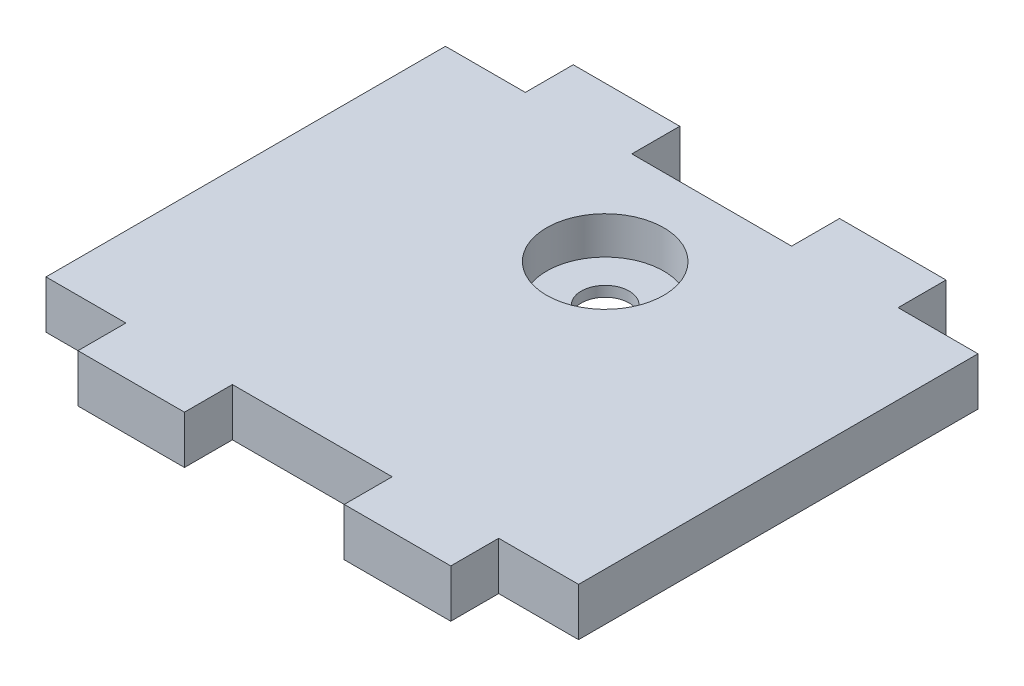
ISO-10303-21;
HEADER;
FILE_DESCRIPTION(('STEP AP214'),'2;1');
FILE_NAME('part.step','',(''),(''),'','','');
FILE_SCHEMA(('AUTOMOTIVE_DESIGN { 1 0 10303 214 1 1 1 1 }'));
ENDSEC;
DATA;
#1=APPLICATION_CONTEXT('core data for automotive mechanical design processes');
#2=APPLICATION_PROTOCOL_DEFINITION('international standard','automotive_design',2000,#1);
#3=PRODUCT_CONTEXT('',#1,'mechanical');
#4=PRODUCT('Part','Part','',(#3));
#5=PRODUCT_RELATED_PRODUCT_CATEGORY('part','',(#4));
#6=PRODUCT_DEFINITION_FORMATION('','',#4);
#7=PRODUCT_DEFINITION_CONTEXT('part definition',#1,'design');
#8=PRODUCT_DEFINITION('design','',#6,#7);
#9=PRODUCT_DEFINITION_SHAPE('','',#8);
#10=(LENGTH_UNIT() NAMED_UNIT(*) SI_UNIT(.MILLI.,.METRE.));
#11=(NAMED_UNIT(*) PLANE_ANGLE_UNIT() SI_UNIT($,.RADIAN.));
#12=(NAMED_UNIT(*) SI_UNIT($,.STERADIAN.) SOLID_ANGLE_UNIT());
#13=UNCERTAINTY_MEASURE_WITH_UNIT(LENGTH_MEASURE(1.E-05),#10,'distance_accuracy_value','');
#14=(GEOMETRIC_REPRESENTATION_CONTEXT(3) GLOBAL_UNCERTAINTY_ASSIGNED_CONTEXT((#13)) GLOBAL_UNIT_ASSIGNED_CONTEXT((#10,
#11,#12)) REPRESENTATION_CONTEXT('',''));
#15=CARTESIAN_POINT('',(0.,0.,0.));
#16=DIRECTION('',(0.,0.,1.));
#17=DIRECTION('',(1.,0.,0.));
#18=AXIS2_PLACEMENT_3D('',#15,#16,#17);
#19=CARTESIAN_POINT('',(0.,9.,-17.5));
#20=DIRECTION('',(0.,-1.,0.));
#21=DIRECTION('',(0.,0.,-1.));
#22=AXIS2_PLACEMENT_3D('',#19,#20,#21);
#23=CYLINDRICAL_SURFACE('',#22,4.5);
#24=CARTESIAN_POINT('',(0.,0.,-17.5));
#25=DIRECTION('',(0.,1.,0.));
#26=DIRECTION('',(0.,0.,1.));
#27=AXIS2_PLACEMENT_3D('',#24,#25,#26);
#28=CIRCLE('',#27,4.5);
#29=CARTESIAN_POINT('',(0.,0.,-13.));
#30=VERTEX_POINT('',#29);
#31=EDGE_CURVE('E203',#30,#30,#28,.T.);
#32=ORIENTED_EDGE('',*,*,#31,.F.);
#33=EDGE_LOOP('',(#32));
#34=FACE_BOUND('',#33,.T.);
#35=CARTESIAN_POINT('',(0.,1.95,-17.5));
#36=DIRECTION('',(0.,1.,0.));
#37=DIRECTION('',(0.,0.,1.));
#38=AXIS2_PLACEMENT_3D('',#35,#36,#37);
#39=CIRCLE('',#38,4.5);
#40=CARTESIAN_POINT('',(0.,1.95,-13.));
#41=VERTEX_POINT('',#40);
#42=EDGE_CURVE('E39',#41,#41,#39,.T.);
#43=ORIENTED_EDGE('',*,*,#42,.T.);
#44=EDGE_LOOP('',(#43));
#45=FACE_BOUND('',#44,.T.);
#46=ADVANCED_FACE('F36',(#34,#45),#23,.F.);
#47=CARTESIAN_POINT('',(50.,9.,0.));
#48=DIRECTION('',(1.,0.,0.));
#49=DIRECTION('',(0.,0.,-1.));
#50=AXIS2_PLACEMENT_3D('',#47,#48,#49);
#51=PLANE('',#50);
#52=DIRECTION('',(0.,0.,1.));
#53=VECTOR('',#52,1.);
#54=CARTESIAN_POINT('',(50.,0.,0.));
#55=LINE('',#54,#53);
#56=CARTESIAN_POINT('',(50.,0.,-37.5));
#57=VERTEX_POINT('',#56);
#58=CARTESIAN_POINT('',(50.,0.,37.5));
#59=VERTEX_POINT('',#58);
#60=EDGE_CURVE('E206',#57,#59,#55,.T.);
#61=ORIENTED_EDGE('',*,*,#60,.F.);
#62=DIRECTION('',(0.,-1.,0.));
#63=VECTOR('',#62,1.);
#64=CARTESIAN_POINT('',(50.,9.,-37.5));
#65=LINE('',#64,#63);
#66=CARTESIAN_POINT('',(50.,9.,-37.5));
#67=VERTEX_POINT('',#66);
#68=EDGE_CURVE('E11',#67,#57,#65,.T.);
#69=ORIENTED_EDGE('',*,*,#68,.F.);
#70=DIRECTION('',(0.,0.,1.));
#71=VECTOR('',#70,1.);
#72=CARTESIAN_POINT('',(50.,9.,0.));
#73=LINE('',#72,#71);
#74=CARTESIAN_POINT('',(50.,9.,37.5));
#75=VERTEX_POINT('',#74);
#76=EDGE_CURVE('E307',#67,#75,#73,.T.);
#77=ORIENTED_EDGE('',*,*,#76,.T.);
#78=DIRECTION('',(0.,-1.,0.));
#79=VECTOR('',#78,1.);
#80=CARTESIAN_POINT('',(50.,9.,37.5));
#81=LINE('',#80,#79);
#82=EDGE_CURVE('E123',#75,#59,#81,.T.);
#83=ORIENTED_EDGE('',*,*,#82,.T.);
#84=EDGE_LOOP('',(#61,#69,#77,#83));
#85=FACE_BOUND('',#84,.T.);
#86=ADVANCED_FACE('F306',(#85),#51,.T.);
#87=CARTESIAN_POINT('',(0.,9.,-37.5));
#88=DIRECTION('',(0.,0.,-1.));
#89=DIRECTION('',(-1.,0.,0.));
#90=AXIS2_PLACEMENT_3D('',#87,#88,#89);
#91=PLANE('',#90);
#92=DIRECTION('',(1.,0.,0.));
#93=VECTOR('',#92,1.);
#94=CARTESIAN_POINT('',(0.,0.,-37.5));
#95=LINE('',#94,#93);
#96=CARTESIAN_POINT('',(35.,0.,-37.5));
#97=VERTEX_POINT('',#96);
#98=EDGE_CURVE('E209',#97,#57,#95,.T.);
#99=ORIENTED_EDGE('',*,*,#98,.F.);
#100=DIRECTION('',(0.,-1.,0.));
#101=VECTOR('',#100,1.);
#102=CARTESIAN_POINT('',(35.,9.,-37.5));
#103=LINE('',#102,#101);
#104=CARTESIAN_POINT('',(35.,9.,-37.5));
#105=VERTEX_POINT('',#104);
#106=EDGE_CURVE('E45',#105,#97,#103,.T.);
#107=ORIENTED_EDGE('',*,*,#106,.F.);
#108=DIRECTION('',(1.,0.,0.));
#109=VECTOR('',#108,1.);
#110=CARTESIAN_POINT('',(0.,9.,-37.5));
#111=LINE('',#110,#109);
#112=EDGE_CURVE('E305',#105,#67,#111,.T.);
#113=ORIENTED_EDGE('',*,*,#112,.T.);
#114=ORIENTED_EDGE('',*,*,#68,.T.);
#115=EDGE_LOOP('',(#99,#107,#113,#114));
#116=FACE_BOUND('',#115,.T.);
#117=ADVANCED_FACE('F304',(#116),#91,.T.);
#118=CARTESIAN_POINT('',(35.,9.,0.));
#119=DIRECTION('',(-1.,0.,0.));
#120=DIRECTION('',(0.,0.,1.));
#121=AXIS2_PLACEMENT_3D('',#118,#119,#120);
#122=PLANE('',#121);
#123=DIRECTION('',(0.,0.,-1.));
#124=VECTOR('',#123,1.);
#125=CARTESIAN_POINT('',(35.,0.,0.));
#126=LINE('',#125,#124);
#127=CARTESIAN_POINT('',(35.,0.,-46.5));
#128=VERTEX_POINT('',#127);
#129=EDGE_CURVE('E212',#97,#128,#126,.T.);
#130=ORIENTED_EDGE('',*,*,#129,.T.);
#131=DIRECTION('',(0.,-1.,0.));
#132=VECTOR('',#131,1.);
#133=CARTESIAN_POINT('',(35.,9.,-46.5));
#134=LINE('',#133,#132);
#135=CARTESIAN_POINT('',(35.,9.,-46.5));
#136=VERTEX_POINT('',#135);
#137=EDGE_CURVE('E288',#136,#128,#134,.T.);
#138=ORIENTED_EDGE('',*,*,#137,.F.);
#139=DIRECTION('',(0.,0.,-1.));
#140=VECTOR('',#139,1.);
#141=CARTESIAN_POINT('',(35.,9.,0.));
#142=LINE('',#141,#140);
#143=EDGE_CURVE('E297',#105,#136,#142,.T.);
#144=ORIENTED_EDGE('',*,*,#143,.F.);
#145=ORIENTED_EDGE('',*,*,#106,.T.);
#146=EDGE_LOOP('',(#130,#138,#144,#145));
#147=FACE_BOUND('',#146,.T.);
#148=ADVANCED_FACE('F294',(#147),#122,.F.);
#149=CARTESIAN_POINT('',(0.,9.,-46.5));
#150=DIRECTION('',(0.,0.,1.));
#151=DIRECTION('',(1.,0.,0.));
#152=AXIS2_PLACEMENT_3D('',#149,#150,#151);
#153=PLANE('',#152);
#154=DIRECTION('',(-1.,0.,0.));
#155=VECTOR('',#154,1.);
#156=CARTESIAN_POINT('',(0.,0.,-46.5));
#157=LINE('',#156,#155);
#158=CARTESIAN_POINT('',(15.,0.,-46.5));
#159=VERTEX_POINT('',#158);
#160=EDGE_CURVE('E217',#128,#159,#157,.T.);
#161=ORIENTED_EDGE('',*,*,#160,.T.);
#162=DIRECTION('',(0.,-1.,0.));
#163=VECTOR('',#162,1.);
#164=CARTESIAN_POINT('',(15.,9.,-46.5));
#165=LINE('',#164,#163);
#166=CARTESIAN_POINT('',(15.,9.,-46.5));
#167=VERTEX_POINT('',#166);
#168=EDGE_CURVE('E286',#167,#159,#165,.T.);
#169=ORIENTED_EDGE('',*,*,#168,.F.);
#170=DIRECTION('',(-1.,0.,0.));
#171=VECTOR('',#170,1.);
#172=CARTESIAN_POINT('',(0.,9.,-46.5));
#173=LINE('',#172,#171);
#174=EDGE_CURVE('E363',#136,#167,#173,.T.);
#175=ORIENTED_EDGE('',*,*,#174,.F.);
#176=ORIENTED_EDGE('',*,*,#137,.T.);
#177=EDGE_LOOP('',(#161,#169,#175,#176));
#178=FACE_BOUND('',#177,.T.);
#179=ADVANCED_FACE('F362',(#178),#153,.F.);
#180=CARTESIAN_POINT('',(15.,9.,0.));
#181=DIRECTION('',(-1.,0.,0.));
#182=DIRECTION('',(0.,0.,1.));
#183=AXIS2_PLACEMENT_3D('',#180,#181,#182);
#184=PLANE('',#183);
#185=DIRECTION('',(0.,0.,-1.));
#186=VECTOR('',#185,1.);
#187=CARTESIAN_POINT('',(15.,0.,0.));
#188=LINE('',#187,#186);
#189=CARTESIAN_POINT('',(15.,0.,-37.5));
#190=VERTEX_POINT('',#189);
#191=EDGE_CURVE('E220',#190,#159,#188,.T.);
#192=ORIENTED_EDGE('',*,*,#191,.F.);
#193=DIRECTION('',(0.,-1.,0.));
#194=VECTOR('',#193,1.);
#195=CARTESIAN_POINT('',(15.,9.,-37.5));
#196=LINE('',#195,#194);
#197=CARTESIAN_POINT('',(15.,9.,-37.5));
#198=VERTEX_POINT('',#197);
#199=EDGE_CURVE('E284',#198,#190,#196,.T.);
#200=ORIENTED_EDGE('',*,*,#199,.F.);
#201=DIRECTION('',(0.,0.,-1.));
#202=VECTOR('',#201,1.);
#203=CARTESIAN_POINT('',(15.,9.,0.));
#204=LINE('',#203,#202);
#205=EDGE_CURVE('E360',#198,#167,#204,.T.);
#206=ORIENTED_EDGE('',*,*,#205,.T.);
#207=ORIENTED_EDGE('',*,*,#168,.T.);
#208=EDGE_LOOP('',(#192,#200,#206,#207));
#209=FACE_BOUND('',#208,.T.);
#210=ADVANCED_FACE('F358',(#209),#184,.T.);
#211=CARTESIAN_POINT('',(-15.,0.,-37.5));
#212=VERTEX_POINT('',#211);
#213=EDGE_CURVE('E214',#212,#190,#95,.T.);
#214=ORIENTED_EDGE('',*,*,#213,.F.);
#215=DIRECTION('',(0.,-1.,0.));
#216=VECTOR('',#215,1.);
#217=CARTESIAN_POINT('',(-15.,9.,-37.5));
#218=LINE('',#217,#216);
#219=CARTESIAN_POINT('',(-15.,9.,-37.5));
#220=VERTEX_POINT('',#219);
#221=EDGE_CURVE('E282',#220,#212,#218,.T.);
#222=ORIENTED_EDGE('',*,*,#221,.F.);
#223=EDGE_CURVE('E354',#220,#198,#111,.T.);
#224=ORIENTED_EDGE('',*,*,#223,.T.);
#225=ORIENTED_EDGE('',*,*,#199,.T.);
#226=EDGE_LOOP('',(#214,#222,#224,#225));
#227=FACE_BOUND('',#226,.T.);
#228=ADVANCED_FACE('F350',(#227),#91,.T.);
#229=CARTESIAN_POINT('',(-15.,9.,0.));
#230=DIRECTION('',(-1.,0.,0.));
#231=DIRECTION('',(0.,0.,1.));
#232=AXIS2_PLACEMENT_3D('',#229,#230,#231);
#233=PLANE('',#232);
#234=DIRECTION('',(0.,0.,-1.));
#235=VECTOR('',#234,1.);
#236=CARTESIAN_POINT('',(-15.,0.,0.));
#237=LINE('',#236,#235);
#238=CARTESIAN_POINT('',(-15.,0.,-46.5));
#239=VERTEX_POINT('',#238);
#240=EDGE_CURVE('E223',#212,#239,#237,.T.);
#241=ORIENTED_EDGE('',*,*,#240,.T.);
#242=DIRECTION('',(0.,-1.,0.));
#243=VECTOR('',#242,1.);
#244=CARTESIAN_POINT('',(-15.,9.,-46.5));
#245=LINE('',#244,#243);
#246=CARTESIAN_POINT('',(-15.,9.,-46.5));
#247=VERTEX_POINT('',#246);
#248=EDGE_CURVE('E280',#247,#239,#245,.T.);
#249=ORIENTED_EDGE('',*,*,#248,.F.);
#250=DIRECTION('',(0.,0.,-1.));
#251=VECTOR('',#250,1.);
#252=CARTESIAN_POINT('',(-15.,9.,0.));
#253=LINE('',#252,#251);
#254=EDGE_CURVE('E370',#220,#247,#253,.T.);
#255=ORIENTED_EDGE('',*,*,#254,.F.);
#256=ORIENTED_EDGE('',*,*,#221,.T.);
#257=EDGE_LOOP('',(#241,#249,#255,#256));
#258=FACE_BOUND('',#257,.T.);
#259=ADVANCED_FACE('F393',(#258),#233,.F.);
#260=CARTESIAN_POINT('',(0.,9.,-46.5));
#261=DIRECTION('',(0.,0.,-1.));
#262=DIRECTION('',(-1.,0.,0.));
#263=AXIS2_PLACEMENT_3D('',#260,#261,#262);
#264=PLANE('',#263);
#265=DIRECTION('',(1.,0.,0.));
#266=VECTOR('',#265,1.);
#267=CARTESIAN_POINT('',(0.,0.,-46.5));
#268=LINE('',#267,#266);
#269=CARTESIAN_POINT('',(-35.,0.,-46.5));
#270=VERTEX_POINT('',#269);
#271=EDGE_CURVE('E226',#270,#239,#268,.T.);
#272=ORIENTED_EDGE('',*,*,#271,.F.);
#273=DIRECTION('',(0.,-1.,0.));
#274=VECTOR('',#273,1.);
#275=CARTESIAN_POINT('',(-35.,9.,-46.5));
#276=LINE('',#275,#274);
#277=CARTESIAN_POINT('',(-35.,9.,-46.5));
#278=VERTEX_POINT('',#277);
#279=EDGE_CURVE('E278',#278,#270,#276,.T.);
#280=ORIENTED_EDGE('',*,*,#279,.F.);
#281=DIRECTION('',(1.,0.,0.));
#282=VECTOR('',#281,1.);
#283=CARTESIAN_POINT('',(0.,9.,-46.5));
#284=LINE('',#283,#282);
#285=EDGE_CURVE('E372',#278,#247,#284,.T.);
#286=ORIENTED_EDGE('',*,*,#285,.T.);
#287=ORIENTED_EDGE('',*,*,#248,.T.);
#288=EDGE_LOOP('',(#272,#280,#286,#287));
#289=FACE_BOUND('',#288,.T.);
#290=ADVANCED_FACE('F390',(#289),#264,.T.);
#291=CARTESIAN_POINT('',(-35.,9.,0.));
#292=DIRECTION('',(-1.,0.,0.));
#293=DIRECTION('',(0.,0.,1.));
#294=AXIS2_PLACEMENT_3D('',#291,#292,#293);
#295=PLANE('',#294);
#296=DIRECTION('',(0.,0.,-1.));
#297=VECTOR('',#296,1.);
#298=CARTESIAN_POINT('',(-35.,0.,0.));
#299=LINE('',#298,#297);
#300=CARTESIAN_POINT('',(-35.,0.,-37.5));
#301=VERTEX_POINT('',#300);
#302=EDGE_CURVE('E229',#301,#270,#299,.T.);
#303=ORIENTED_EDGE('',*,*,#302,.F.);
#304=DIRECTION('',(0.,-1.,0.));
#305=VECTOR('',#304,1.);
#306=CARTESIAN_POINT('',(-35.,9.,-37.5));
#307=LINE('',#306,#305);
#308=CARTESIAN_POINT('',(-35.,9.,-37.5));
#309=VERTEX_POINT('',#308);
#310=EDGE_CURVE('E276',#309,#301,#307,.T.);
#311=ORIENTED_EDGE('',*,*,#310,.F.);
#312=DIRECTION('',(0.,0.,-1.));
#313=VECTOR('',#312,1.);
#314=CARTESIAN_POINT('',(-35.,9.,0.));
#315=LINE('',#314,#313);
#316=EDGE_CURVE('E375',#309,#278,#315,.T.);
#317=ORIENTED_EDGE('',*,*,#316,.T.);
#318=ORIENTED_EDGE('',*,*,#279,.T.);
#319=EDGE_LOOP('',(#303,#311,#317,#318));
#320=FACE_BOUND('',#319,.T.);
#321=ADVANCED_FACE('F387',(#320),#295,.T.);
#322=CARTESIAN_POINT('',(-50.,0.,-37.5));
#323=VERTEX_POINT('',#322);
#324=EDGE_CURVE('E213',#323,#301,#95,.T.);
#325=ORIENTED_EDGE('',*,*,#324,.F.);
#326=DIRECTION('',(0.,-1.,0.));
#327=VECTOR('',#326,1.);
#328=CARTESIAN_POINT('',(-50.,9.,-37.5));
#329=LINE('',#328,#327);
#330=CARTESIAN_POINT('',(-50.,9.,-37.5));
#331=VERTEX_POINT('',#330);
#332=EDGE_CURVE('E274',#331,#323,#329,.T.);
#333=ORIENTED_EDGE('',*,*,#332,.F.);
#334=EDGE_CURVE('E367',#331,#309,#111,.T.);
#335=ORIENTED_EDGE('',*,*,#334,.T.);
#336=ORIENTED_EDGE('',*,*,#310,.T.);
#337=EDGE_LOOP('',(#325,#333,#335,#336));
#338=FACE_BOUND('',#337,.T.);
#339=ADVANCED_FACE('F342',(#338),#91,.T.);
#340=CARTESIAN_POINT('',(-50.,9.,0.));
#341=DIRECTION('',(1.,0.,0.));
#342=DIRECTION('',(0.,0.,-1.));
#343=AXIS2_PLACEMENT_3D('',#340,#341,#342);
#344=PLANE('',#343);
#345=DIRECTION('',(0.,0.,1.));
#346=VECTOR('',#345,1.);
#347=CARTESIAN_POINT('',(-50.,0.,0.));
#348=LINE('',#347,#346);
#349=CARTESIAN_POINT('',(-50.,0.,37.5));
#350=VERTEX_POINT('',#349);
#351=EDGE_CURVE('E232',#323,#350,#348,.T.);
#352=ORIENTED_EDGE('',*,*,#351,.T.);
#353=DIRECTION('',(0.,-1.,0.));
#354=VECTOR('',#353,1.);
#355=CARTESIAN_POINT('',(-50.,9.,37.5));
#356=LINE('',#355,#354);
#357=CARTESIAN_POINT('',(-50.,9.,37.5));
#358=VERTEX_POINT('',#357);
#359=EDGE_CURVE('E271',#358,#350,#356,.T.);
#360=ORIENTED_EDGE('',*,*,#359,.F.);
#361=DIRECTION('',(0.,0.,1.));
#362=VECTOR('',#361,1.);
#363=CARTESIAN_POINT('',(-50.,9.,0.));
#364=LINE('',#363,#362);
#365=EDGE_CURVE('E378',#331,#358,#364,.T.);
#366=ORIENTED_EDGE('',*,*,#365,.F.);
#367=ORIENTED_EDGE('',*,*,#332,.T.);
#368=EDGE_LOOP('',(#352,#360,#366,#367));
#369=FACE_BOUND('',#368,.T.);
#370=ADVANCED_FACE('F338',(#369),#344,.F.);
#371=CARTESIAN_POINT('',(0.,9.,37.5));
#372=DIRECTION('',(0.,0.,-1.));
#373=DIRECTION('',(-1.,0.,0.));
#374=AXIS2_PLACEMENT_3D('',#371,#372,#373);
#375=PLANE('',#374);
#376=DIRECTION('',(1.,0.,0.));
#377=VECTOR('',#376,1.);
#378=CARTESIAN_POINT('',(0.,0.,37.5));
#379=LINE('',#378,#377);
#380=CARTESIAN_POINT('',(-35.,0.,37.5));
#381=VERTEX_POINT('',#380);
#382=EDGE_CURVE('E235',#350,#381,#379,.T.);
#383=ORIENTED_EDGE('',*,*,#382,.T.);
#384=DIRECTION('',(0.,-1.,0.));
#385=VECTOR('',#384,1.);
#386=CARTESIAN_POINT('',(-35.,9.,37.5));
#387=LINE('',#386,#385);
#388=CARTESIAN_POINT('',(-35.,9.,37.5));
#389=VERTEX_POINT('',#388);
#390=EDGE_CURVE('E268',#389,#381,#387,.T.);
#391=ORIENTED_EDGE('',*,*,#390,.F.);
#392=DIRECTION('',(1.,0.,0.));
#393=VECTOR('',#392,1.);
#394=CARTESIAN_POINT('',(0.,9.,37.5));
#395=LINE('',#394,#393);
#396=EDGE_CURVE('E200',#358,#389,#395,.T.);
#397=ORIENTED_EDGE('',*,*,#396,.F.);
#398=ORIENTED_EDGE('',*,*,#359,.T.);
#399=EDGE_LOOP('',(#383,#391,#397,#398));
#400=FACE_BOUND('',#399,.T.);
#401=ADVANCED_FACE('F333',(#400),#375,.F.);
#402=CARTESIAN_POINT('',(-35.0000000000001,9.,0.));
#403=DIRECTION('',(1.,0.,0.));
#404=DIRECTION('',(0.,0.,-1.));
#405=AXIS2_PLACEMENT_3D('',#402,#403,#404);
#406=PLANE('',#405);
#407=DIRECTION('',(0.,0.,1.));
#408=VECTOR('',#407,1.);
#409=CARTESIAN_POINT('',(-35.0000000000001,0.,0.));
#410=LINE('',#409,#408);
#411=CARTESIAN_POINT('',(-35.,0.,46.5));
#412=VERTEX_POINT('',#411);
#413=EDGE_CURVE('E238',#381,#412,#410,.T.);
#414=ORIENTED_EDGE('',*,*,#413,.T.);
#415=DIRECTION('',(0.,-1.,0.));
#416=VECTOR('',#415,1.);
#417=CARTESIAN_POINT('',(-35.,9.,46.5));
#418=LINE('',#417,#416);
#419=CARTESIAN_POINT('',(-35.,9.,46.5));
#420=VERTEX_POINT('',#419);
#421=EDGE_CURVE('E265',#420,#412,#418,.T.);
#422=ORIENTED_EDGE('',*,*,#421,.F.);
#423=DIRECTION('',(0.,0.,1.));
#424=VECTOR('',#423,1.);
#425=CARTESIAN_POINT('',(-35.0000000000001,9.,0.));
#426=LINE('',#425,#424);
#427=EDGE_CURVE('E330',#389,#420,#426,.T.);
#428=ORIENTED_EDGE('',*,*,#427,.F.);
#429=ORIENTED_EDGE('',*,*,#390,.T.);
#430=EDGE_LOOP('',(#414,#422,#428,#429));
#431=FACE_BOUND('',#430,.T.);
#432=ADVANCED_FACE('F328',(#431),#406,.F.);
#433=CARTESIAN_POINT('',(0.,9.,46.5));
#434=DIRECTION('',(0.,0.,-1.));
#435=DIRECTION('',(-1.,0.,0.));
#436=AXIS2_PLACEMENT_3D('',#433,#434,#435);
#437=PLANE('',#436);
#438=DIRECTION('',(1.,0.,0.));
#439=VECTOR('',#438,1.);
#440=CARTESIAN_POINT('',(0.,0.,46.5));
#441=LINE('',#440,#439);
#442=CARTESIAN_POINT('',(-15.,0.,46.5));
#443=VERTEX_POINT('',#442);
#444=EDGE_CURVE('E243',#412,#443,#441,.T.);
#445=ORIENTED_EDGE('',*,*,#444,.T.);
#446=DIRECTION('',(0.,-1.,0.));
#447=VECTOR('',#446,1.);
#448=CARTESIAN_POINT('',(-15.,9.,46.5));
#449=LINE('',#448,#447);
#450=CARTESIAN_POINT('',(-15.,9.,46.5));
#451=VERTEX_POINT('',#450);
#452=EDGE_CURVE('E263',#451,#443,#449,.T.);
#453=ORIENTED_EDGE('',*,*,#452,.F.);
#454=DIRECTION('',(1.,0.,0.));
#455=VECTOR('',#454,1.);
#456=CARTESIAN_POINT('',(0.,9.,46.5));
#457=LINE('',#456,#455);
#458=EDGE_CURVE('E381',#420,#451,#457,.T.);
#459=ORIENTED_EDGE('',*,*,#458,.F.);
#460=ORIENTED_EDGE('',*,*,#421,.T.);
#461=EDGE_LOOP('',(#445,#453,#459,#460));
#462=FACE_BOUND('',#461,.T.);
#463=ADVANCED_FACE('F323',(#462),#437,.F.);
#464=CARTESIAN_POINT('',(-15.,9.,0.));
#465=DIRECTION('',(1.,0.,0.));
#466=DIRECTION('',(0.,0.,-1.));
#467=AXIS2_PLACEMENT_3D('',#464,#465,#466);
#468=PLANE('',#467);
#469=DIRECTION('',(0.,0.,1.));
#470=VECTOR('',#469,1.);
#471=CARTESIAN_POINT('',(-15.,0.,0.));
#472=LINE('',#471,#470);
#473=CARTESIAN_POINT('',(-15.,0.,37.5));
#474=VERTEX_POINT('',#473);
#475=EDGE_CURVE('E246',#474,#443,#472,.T.);
#476=ORIENTED_EDGE('',*,*,#475,.F.);
#477=DIRECTION('',(0.,-1.,0.));
#478=VECTOR('',#477,1.);
#479=CARTESIAN_POINT('',(-15.,9.,37.5));
#480=LINE('',#479,#478);
#481=CARTESIAN_POINT('',(-15.,9.,37.5));
#482=VERTEX_POINT('',#481);
#483=EDGE_CURVE('E261',#482,#474,#480,.T.);
#484=ORIENTED_EDGE('',*,*,#483,.F.);
#485=DIRECTION('',(0.,0.,1.));
#486=VECTOR('',#485,1.);
#487=CARTESIAN_POINT('',(-15.,9.,0.));
#488=LINE('',#487,#486);
#489=EDGE_CURVE('E321',#482,#451,#488,.T.);
#490=ORIENTED_EDGE('',*,*,#489,.T.);
#491=ORIENTED_EDGE('',*,*,#452,.T.);
#492=EDGE_LOOP('',(#476,#484,#490,#491));
#493=FACE_BOUND('',#492,.T.);
#494=ADVANCED_FACE('F317',(#493),#468,.T.);
#495=CARTESIAN_POINT('',(15.,0.,37.5));
#496=VERTEX_POINT('',#495);
#497=EDGE_CURVE('E240',#474,#496,#379,.T.);
#498=ORIENTED_EDGE('',*,*,#497,.T.);
#499=DIRECTION('',(0.,-1.,0.));
#500=VECTOR('',#499,1.);
#501=CARTESIAN_POINT('',(15.,9.,37.5));
#502=LINE('',#501,#500);
#503=CARTESIAN_POINT('',(15.,9.,37.5));
#504=VERTEX_POINT('',#503);
#505=EDGE_CURVE('E258',#504,#496,#502,.T.);
#506=ORIENTED_EDGE('',*,*,#505,.F.);
#507=EDGE_CURVE('E199',#482,#504,#395,.T.);
#508=ORIENTED_EDGE('',*,*,#507,.F.);
#509=ORIENTED_EDGE('',*,*,#483,.T.);
#510=EDGE_LOOP('',(#498,#506,#508,#509));
#511=FACE_BOUND('',#510,.T.);
#512=ADVANCED_FACE('F313',(#511),#375,.F.);
#513=CARTESIAN_POINT('',(15.,9.,0.));
#514=DIRECTION('',(1.,0.,0.));
#515=DIRECTION('',(0.,0.,-1.));
#516=AXIS2_PLACEMENT_3D('',#513,#514,#515);
#517=PLANE('',#516);
#518=DIRECTION('',(0.,0.,1.));
#519=VECTOR('',#518,1.);
#520=CARTESIAN_POINT('',(15.,0.,0.));
#521=LINE('',#520,#519);
#522=CARTESIAN_POINT('',(15.,0.,46.5));
#523=VERTEX_POINT('',#522);
#524=EDGE_CURVE('E249',#496,#523,#521,.T.);
#525=ORIENTED_EDGE('',*,*,#524,.T.);
#526=DIRECTION('',(0.,-1.,0.));
#527=VECTOR('',#526,1.);
#528=CARTESIAN_POINT('',(15.,9.,46.5));
#529=LINE('',#528,#527);
#530=CARTESIAN_POINT('',(15.,9.,46.5));
#531=VERTEX_POINT('',#530);
#532=EDGE_CURVE('E188',#531,#523,#529,.T.);
#533=ORIENTED_EDGE('',*,*,#532,.F.);
#534=DIRECTION('',(0.,0.,1.));
#535=VECTOR('',#534,1.);
#536=CARTESIAN_POINT('',(15.,9.,0.));
#537=LINE('',#536,#535);
#538=EDGE_CURVE('E193',#504,#531,#537,.T.);
#539=ORIENTED_EDGE('',*,*,#538,.F.);
#540=ORIENTED_EDGE('',*,*,#505,.T.);
#541=EDGE_LOOP('',(#525,#533,#539,#540));
#542=FACE_BOUND('',#541,.T.);
#543=ADVANCED_FACE('F442',(#542),#517,.F.);
#544=CARTESIAN_POINT('',(0.,9.,46.5));
#545=DIRECTION('',(0.,0.,1.));
#546=DIRECTION('',(1.,0.,0.));
#547=AXIS2_PLACEMENT_3D('',#544,#545,#546);
#548=PLANE('',#547);
#549=DIRECTION('',(-1.,0.,0.));
#550=VECTOR('',#549,1.);
#551=CARTESIAN_POINT('',(0.,0.,46.5));
#552=LINE('',#551,#550);
#553=CARTESIAN_POINT('',(35.,0.,46.5));
#554=VERTEX_POINT('',#553);
#555=EDGE_CURVE('E183',#554,#523,#552,.T.);
#556=ORIENTED_EDGE('',*,*,#555,.F.);
#557=DIRECTION('',(0.,-1.,0.));
#558=VECTOR('',#557,1.);
#559=CARTESIAN_POINT('',(35.,9.,46.5));
#560=LINE('',#559,#558);
#561=CARTESIAN_POINT('',(35.,9.,46.5));
#562=VERTEX_POINT('',#561);
#563=EDGE_CURVE('E178',#562,#554,#560,.T.);
#564=ORIENTED_EDGE('',*,*,#563,.F.);
#565=DIRECTION('',(-1.,0.,0.));
#566=VECTOR('',#565,1.);
#567=CARTESIAN_POINT('',(0.,9.,46.5));
#568=LINE('',#567,#566);
#569=EDGE_CURVE('E181',#562,#531,#568,.T.);
#570=ORIENTED_EDGE('',*,*,#569,.T.);
#571=ORIENTED_EDGE('',*,*,#532,.T.);
#572=EDGE_LOOP('',(#556,#564,#570,#571));
#573=FACE_BOUND('',#572,.T.);
#574=ADVANCED_FACE('F180',(#573),#548,.T.);
#575=CARTESIAN_POINT('',(35.,9.,0.));
#576=DIRECTION('',(1.,0.,0.));
#577=DIRECTION('',(0.,0.,-1.));
#578=AXIS2_PLACEMENT_3D('',#575,#576,#577);
#579=PLANE('',#578);
#580=DIRECTION('',(0.,0.,1.));
#581=VECTOR('',#580,1.);
#582=CARTESIAN_POINT('',(35.,0.,0.));
#583=LINE('',#582,#581);
#584=CARTESIAN_POINT('',(35.,0.,37.5));
#585=VERTEX_POINT('',#584);
#586=EDGE_CURVE('E253',#585,#554,#583,.T.);
#587=ORIENTED_EDGE('',*,*,#586,.F.);
#588=DIRECTION('',(0.,-1.,0.));
#589=VECTOR('',#588,1.);
#590=CARTESIAN_POINT('',(35.,9.,37.5));
#591=LINE('',#590,#589);
#592=CARTESIAN_POINT('',(35.,9.,37.5));
#593=VERTEX_POINT('',#592);
#594=EDGE_CURVE('E116',#593,#585,#591,.T.);
#595=ORIENTED_EDGE('',*,*,#594,.F.);
#596=DIRECTION('',(0.,0.,1.));
#597=VECTOR('',#596,1.);
#598=CARTESIAN_POINT('',(35.,9.,0.));
#599=LINE('',#598,#597);
#600=EDGE_CURVE('E191',#593,#562,#599,.T.);
#601=ORIENTED_EDGE('',*,*,#600,.T.);
#602=ORIENTED_EDGE('',*,*,#563,.T.);
#603=EDGE_LOOP('',(#587,#595,#601,#602));
#604=FACE_BOUND('',#603,.T.);
#605=ADVANCED_FACE('F196',(#604),#579,.T.);
#606=EDGE_CURVE('E239',#585,#59,#379,.T.);
#607=ORIENTED_EDGE('',*,*,#606,.T.);
#608=ORIENTED_EDGE('',*,*,#82,.F.);
#609=EDGE_CURVE('E53',#593,#75,#395,.T.);
#610=ORIENTED_EDGE('',*,*,#609,.F.);
#611=ORIENTED_EDGE('',*,*,#594,.T.);
#612=EDGE_LOOP('',(#607,#608,#610,#611));
#613=FACE_BOUND('',#612,.T.);
#614=ADVANCED_FACE('F426',(#613),#375,.F.);
#615=CARTESIAN_POINT('',(0.,9.,0.));
#616=DIRECTION('',(0.,1.,0.));
#617=DIRECTION('',(0.,0.,1.));
#618=AXIS2_PLACEMENT_3D('',#615,#616,#617);
#619=PLANE('',#618);
#620=CARTESIAN_POINT('',(0.,9.,-17.5));
#621=DIRECTION('',(0.,1.,0.));
#622=DIRECTION('',(0.,0.,1.));
#623=AXIS2_PLACEMENT_3D('',#620,#621,#622);
#624=CIRCLE('',#623,11.);
#625=CARTESIAN_POINT('',(0.,9.,-6.5));
#626=VERTEX_POINT('',#625);
#627=EDGE_CURVE('E415',#626,#626,#624,.T.);
#628=ORIENTED_EDGE('',*,*,#627,.F.);
#629=EDGE_LOOP('',(#628));
#630=FACE_BOUND('',#629,.T.);
#631=ORIENTED_EDGE('',*,*,#76,.F.);
#632=ORIENTED_EDGE('',*,*,#112,.F.);
#633=ORIENTED_EDGE('',*,*,#143,.T.);
#634=ORIENTED_EDGE('',*,*,#174,.T.);
#635=ORIENTED_EDGE('',*,*,#205,.F.);
#636=ORIENTED_EDGE('',*,*,#223,.F.);
#637=ORIENTED_EDGE('',*,*,#254,.T.);
#638=ORIENTED_EDGE('',*,*,#285,.F.);
#639=ORIENTED_EDGE('',*,*,#316,.F.);
#640=ORIENTED_EDGE('',*,*,#334,.F.);
#641=ORIENTED_EDGE('',*,*,#365,.T.);
#642=ORIENTED_EDGE('',*,*,#396,.T.);
#643=ORIENTED_EDGE('',*,*,#427,.T.);
#644=ORIENTED_EDGE('',*,*,#458,.T.);
#645=ORIENTED_EDGE('',*,*,#489,.F.);
#646=ORIENTED_EDGE('',*,*,#507,.T.);
#647=ORIENTED_EDGE('',*,*,#538,.T.);
#648=ORIENTED_EDGE('',*,*,#569,.F.);
#649=ORIENTED_EDGE('',*,*,#600,.F.);
#650=ORIENTED_EDGE('',*,*,#609,.T.);
#651=EDGE_LOOP('',(#631,#632,#633,#634,#635,#636,#637,#638,#639,#640,#641,#642,#643,#644,#645,
#646,#647,#648,#649,#650));
#652=FACE_BOUND('',#651,.T.);
#653=ADVANCED_FACE('F190',(#630,#652),#619,.T.);
#654=CARTESIAN_POINT('',(0.,0.,0.));
#655=DIRECTION('',(0.,1.,0.));
#656=DIRECTION('',(0.,0.,1.));
#657=AXIS2_PLACEMENT_3D('',#654,#655,#656);
#658=PLANE('',#657);
#659=ORIENTED_EDGE('',*,*,#31,.T.);
#660=EDGE_LOOP('',(#659));
#661=FACE_BOUND('',#660,.T.);
#662=ORIENTED_EDGE('',*,*,#60,.T.);
#663=ORIENTED_EDGE('',*,*,#606,.F.);
#664=ORIENTED_EDGE('',*,*,#586,.T.);
#665=ORIENTED_EDGE('',*,*,#555,.T.);
#666=ORIENTED_EDGE('',*,*,#524,.F.);
#667=ORIENTED_EDGE('',*,*,#497,.F.);
#668=ORIENTED_EDGE('',*,*,#475,.T.);
#669=ORIENTED_EDGE('',*,*,#444,.F.);
#670=ORIENTED_EDGE('',*,*,#413,.F.);
#671=ORIENTED_EDGE('',*,*,#382,.F.);
#672=ORIENTED_EDGE('',*,*,#351,.F.);
#673=ORIENTED_EDGE('',*,*,#324,.T.);
#674=ORIENTED_EDGE('',*,*,#302,.T.);
#675=ORIENTED_EDGE('',*,*,#271,.T.);
#676=ORIENTED_EDGE('',*,*,#240,.F.);
#677=ORIENTED_EDGE('',*,*,#213,.T.);
#678=ORIENTED_EDGE('',*,*,#191,.T.);
#679=ORIENTED_EDGE('',*,*,#160,.F.);
#680=ORIENTED_EDGE('',*,*,#129,.F.);
#681=ORIENTED_EDGE('',*,*,#98,.T.);
#682=EDGE_LOOP('',(#662,#663,#664,#665,#666,#667,#668,#669,#670,#671,#672,#673,#674,#675,#676,
#677,#678,#679,#680,#681));
#683=FACE_BOUND('',#682,.T.);
#684=ADVANCED_FACE('F303',(#661,#683),#658,.F.);
#685=CARTESIAN_POINT('',(0.,1.95,-17.5));
#686=DIRECTION('',(0.,1.,0.));
#687=DIRECTION('',(0.,0.,1.));
#688=AXIS2_PLACEMENT_3D('',#685,#686,#687);
#689=CYLINDRICAL_SURFACE('',#688,11.);
#690=CARTESIAN_POINT('',(0.,1.95,-17.5));
#691=DIRECTION('',(0.,1.,0.));
#692=DIRECTION('',(0.,0.,1.));
#693=AXIS2_PLACEMENT_3D('',#690,#691,#692);
#694=CIRCLE('',#693,11.);
#695=CARTESIAN_POINT('',(0.,1.95,-6.5));
#696=VERTEX_POINT('',#695);
#697=EDGE_CURVE('E413',#696,#696,#694,.T.);
#698=ORIENTED_EDGE('',*,*,#697,.F.);
#699=EDGE_LOOP('',(#698));
#700=FACE_BOUND('',#699,.T.);
#701=ORIENTED_EDGE('',*,*,#627,.T.);
#702=EDGE_LOOP('',(#701));
#703=FACE_BOUND('',#702,.T.);
#704=ADVANCED_FACE('F423',(#700,#703),#689,.F.);
#705=CARTESIAN_POINT('',(0.,1.95,-17.5));
#706=DIRECTION('',(0.,1.,0.));
#707=DIRECTION('',(0.,0.,1.));
#708=AXIS2_PLACEMENT_3D('',#705,#706,#707);
#709=PLANE('',#708);
#710=ORIENTED_EDGE('',*,*,#42,.F.);
#711=EDGE_LOOP('',(#710));
#712=FACE_BOUND('',#711,.T.);
#713=ORIENTED_EDGE('',*,*,#697,.T.);
#714=EDGE_LOOP('',(#713));
#715=FACE_BOUND('',#714,.T.);
#716=ADVANCED_FACE('F534',(#712,#715),#709,.T.);
#717=CLOSED_SHELL('',(#46,#86,#117,#148,#179,#210,#228,#259,#290,#321,#339,#370,#401,#432,#463,
#494,#512,#543,#574,#605,#614,#653,#684,#704,#716));
#718=MANIFOLD_SOLID_BREP('B2',#717);
#719=ADVANCED_BREP_SHAPE_REPRESENTATION('',(#18,#718),#14);
#720=SHAPE_DEFINITION_REPRESENTATION(#9,#719);
ENDSEC;
END-ISO-10303-21;
